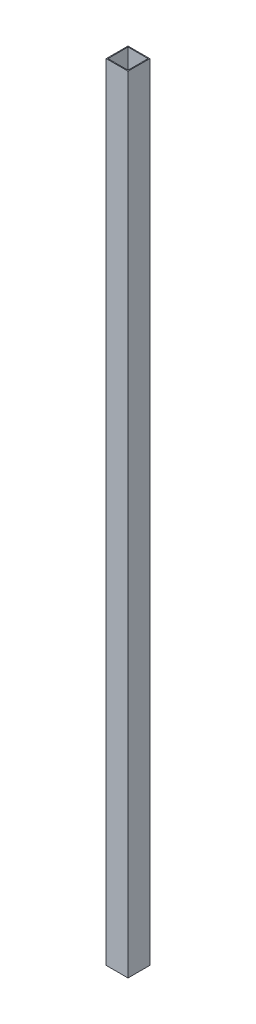
ISO-10303-21;
HEADER;
FILE_DESCRIPTION(('STEP AP214'),'2;1');
FILE_NAME('part.step','',(''),(''),'','','');
FILE_SCHEMA(('AUTOMOTIVE_DESIGN { 1 0 10303 214 1 1 1 1 }'));
ENDSEC;
DATA;
#1=APPLICATION_CONTEXT('core data for automotive mechanical design processes');
#2=APPLICATION_PROTOCOL_DEFINITION('international standard','automotive_design',2000,#1);
#3=PRODUCT_CONTEXT('',#1,'mechanical');
#4=PRODUCT('Part','Part','',(#3));
#5=PRODUCT_RELATED_PRODUCT_CATEGORY('part','',(#4));
#6=PRODUCT_DEFINITION_FORMATION('','',#4);
#7=PRODUCT_DEFINITION_CONTEXT('part definition',#1,'design');
#8=PRODUCT_DEFINITION('design','',#6,#7);
#9=PRODUCT_DEFINITION_SHAPE('','',#8);
#10=(LENGTH_UNIT() NAMED_UNIT(*) SI_UNIT(.MILLI.,.METRE.));
#11=(NAMED_UNIT(*) PLANE_ANGLE_UNIT() SI_UNIT($,.RADIAN.));
#12=(NAMED_UNIT(*) SI_UNIT($,.STERADIAN.) SOLID_ANGLE_UNIT());
#13=UNCERTAINTY_MEASURE_WITH_UNIT(LENGTH_MEASURE(1.E-05),#10,'distance_accuracy_value','');
#14=(GEOMETRIC_REPRESENTATION_CONTEXT(3) GLOBAL_UNCERTAINTY_ASSIGNED_CONTEXT((#13)) GLOBAL_UNIT_ASSIGNED_CONTEXT((#10,
#11,#12)) REPRESENTATION_CONTEXT('',''));
#15=CARTESIAN_POINT('',(0.,0.,0.));
#16=DIRECTION('',(0.,0.,1.));
#17=DIRECTION('',(1.,0.,0.));
#18=AXIS2_PLACEMENT_3D('',#15,#16,#17);
#19=CARTESIAN_POINT('',(0.,1800.,0.));
#20=DIRECTION('',(0.,-1.,0.));
#21=DIRECTION('',(0.,0.,-1.));
#22=AXIS2_PLACEMENT_3D('',#19,#20,#21);
#23=PLANE('',#22);
#24=DIRECTION('',(0.,0.,-1.));
#25=VECTOR('',#24,1.);
#26=CARTESIAN_POINT('',(25.,1800.,25.));
#27=LINE('',#26,#25);
#28=CARTESIAN_POINT('',(25.,1800.,25.));
#29=VERTEX_POINT('',#28);
#30=CARTESIAN_POINT('',(25.,1800.,-25.));
#31=VERTEX_POINT('',#30);
#32=EDGE_CURVE('E153',#29,#31,#27,.T.);
#33=ORIENTED_EDGE('',*,*,#32,.T.);
#34=DIRECTION('',(-1.,0.,0.));
#35=VECTOR('',#34,1.);
#36=CARTESIAN_POINT('',(-25.,1800.,-25.));
#37=LINE('',#36,#35);
#38=CARTESIAN_POINT('',(-25.,1800.,-25.));
#39=VERTEX_POINT('',#38);
#40=EDGE_CURVE('E157',#31,#39,#37,.T.);
#41=ORIENTED_EDGE('',*,*,#40,.T.);
#42=DIRECTION('',(0.,0.,1.));
#43=VECTOR('',#42,1.);
#44=CARTESIAN_POINT('',(-25.,1800.,25.));
#45=LINE('',#44,#43);
#46=CARTESIAN_POINT('',(-25.,1800.,25.));
#47=VERTEX_POINT('',#46);
#48=EDGE_CURVE('E161',#39,#47,#45,.T.);
#49=ORIENTED_EDGE('',*,*,#48,.T.);
#50=DIRECTION('',(1.,0.,0.));
#51=VECTOR('',#50,1.);
#52=CARTESIAN_POINT('',(-25.,1800.,25.));
#53=LINE('',#52,#51);
#54=EDGE_CURVE('E164',#47,#29,#53,.T.);
#55=ORIENTED_EDGE('',*,*,#54,.T.);
#56=EDGE_LOOP('',(#33,#41,#49,#55));
#57=FACE_BOUND('',#56,.T.);
#58=DIRECTION('',(0.,0.,1.));
#59=VECTOR('',#58,1.);
#60=CARTESIAN_POINT('',(-23.,1800.,23.));
#61=LINE('',#60,#59);
#62=CARTESIAN_POINT('',(-23.,1800.,-23.));
#63=VERTEX_POINT('',#62);
#64=CARTESIAN_POINT('',(-23.,1800.,23.));
#65=VERTEX_POINT('',#64);
#66=EDGE_CURVE('E105',#63,#65,#61,.T.);
#67=ORIENTED_EDGE('',*,*,#66,.F.);
#68=DIRECTION('',(-1.,0.,0.));
#69=VECTOR('',#68,1.);
#70=CARTESIAN_POINT('',(-23.,1800.,-23.));
#71=LINE('',#70,#69);
#72=CARTESIAN_POINT('',(23.,1800.,-23.));
#73=VERTEX_POINT('',#72);
#74=EDGE_CURVE('E131',#73,#63,#71,.T.);
#75=ORIENTED_EDGE('',*,*,#74,.F.);
#76=DIRECTION('',(0.,0.,-1.));
#77=VECTOR('',#76,1.);
#78=CARTESIAN_POINT('',(23.,1800.,23.));
#79=LINE('',#78,#77);
#80=CARTESIAN_POINT('',(23.,1800.,23.));
#81=VERTEX_POINT('',#80);
#82=EDGE_CURVE('E127',#81,#73,#79,.T.);
#83=ORIENTED_EDGE('',*,*,#82,.F.);
#84=DIRECTION('',(1.,0.,0.));
#85=VECTOR('',#84,1.);
#86=CARTESIAN_POINT('',(-23.,1800.,23.));
#87=LINE('',#86,#85);
#88=EDGE_CURVE('E114',#65,#81,#87,.T.);
#89=ORIENTED_EDGE('',*,*,#88,.F.);
#90=EDGE_LOOP('',(#67,#75,#83,#89));
#91=FACE_BOUND('',#90,.T.);
#92=ADVANCED_FACE('F39',(#57,#91),#23,.F.);
#93=CARTESIAN_POINT('',(0.,0.,0.));
#94=DIRECTION('',(0.,-1.,0.));
#95=DIRECTION('',(0.,0.,-1.));
#96=AXIS2_PLACEMENT_3D('',#93,#94,#95);
#97=PLANE('',#96);
#98=DIRECTION('',(0.,0.,-1.));
#99=VECTOR('',#98,1.);
#100=CARTESIAN_POINT('',(25.,0.,25.));
#101=LINE('',#100,#99);
#102=CARTESIAN_POINT('',(25.,0.,25.));
#103=VERTEX_POINT('',#102);
#104=CARTESIAN_POINT('',(25.,0.,-25.));
#105=VERTEX_POINT('',#104);
#106=EDGE_CURVE('E123',#103,#105,#101,.T.);
#107=ORIENTED_EDGE('',*,*,#106,.F.);
#108=DIRECTION('',(1.,0.,0.));
#109=VECTOR('',#108,1.);
#110=CARTESIAN_POINT('',(-25.,0.,25.));
#111=LINE('',#110,#109);
#112=CARTESIAN_POINT('',(-25.,0.,25.));
#113=VERTEX_POINT('',#112);
#114=EDGE_CURVE('E158',#113,#103,#111,.T.);
#115=ORIENTED_EDGE('',*,*,#114,.F.);
#116=DIRECTION('',(0.,0.,1.));
#117=VECTOR('',#116,1.);
#118=CARTESIAN_POINT('',(-25.,0.,25.));
#119=LINE('',#118,#117);
#120=CARTESIAN_POINT('',(-25.,0.,-25.));
#121=VERTEX_POINT('',#120);
#122=EDGE_CURVE('E174',#121,#113,#119,.T.);
#123=ORIENTED_EDGE('',*,*,#122,.F.);
#124=DIRECTION('',(-1.,0.,0.));
#125=VECTOR('',#124,1.);
#126=CARTESIAN_POINT('',(-25.,0.,-25.));
#127=LINE('',#126,#125);
#128=EDGE_CURVE('E171',#105,#121,#127,.T.);
#129=ORIENTED_EDGE('',*,*,#128,.F.);
#130=EDGE_LOOP('',(#107,#115,#123,#129));
#131=FACE_BOUND('',#130,.T.);
#132=DIRECTION('',(-1.,0.,0.));
#133=VECTOR('',#132,1.);
#134=CARTESIAN_POINT('',(-23.,0.,-23.));
#135=LINE('',#134,#133);
#136=CARTESIAN_POINT('',(23.,0.,-23.));
#137=VERTEX_POINT('',#136);
#138=CARTESIAN_POINT('',(-23.,0.,-23.));
#139=VERTEX_POINT('',#138);
#140=EDGE_CURVE('E115',#137,#139,#135,.T.);
#141=ORIENTED_EDGE('',*,*,#140,.T.);
#142=DIRECTION('',(0.,0.,1.));
#143=VECTOR('',#142,1.);
#144=CARTESIAN_POINT('',(-23.,0.,23.));
#145=LINE('',#144,#143);
#146=CARTESIAN_POINT('',(-23.,0.,23.));
#147=VERTEX_POINT('',#146);
#148=EDGE_CURVE('E63',#139,#147,#145,.T.);
#149=ORIENTED_EDGE('',*,*,#148,.T.);
#150=DIRECTION('',(1.,0.,0.));
#151=VECTOR('',#150,1.);
#152=CARTESIAN_POINT('',(-23.,0.,23.));
#153=LINE('',#152,#151);
#154=CARTESIAN_POINT('',(23.,0.,23.));
#155=VERTEX_POINT('',#154);
#156=EDGE_CURVE('E121',#147,#155,#153,.T.);
#157=ORIENTED_EDGE('',*,*,#156,.T.);
#158=DIRECTION('',(0.,0.,-1.));
#159=VECTOR('',#158,1.);
#160=CARTESIAN_POINT('',(23.,0.,23.));
#161=LINE('',#160,#159);
#162=EDGE_CURVE('E140',#155,#137,#161,.T.);
#163=ORIENTED_EDGE('',*,*,#162,.T.);
#164=EDGE_LOOP('',(#141,#149,#157,#163));
#165=FACE_BOUND('',#164,.T.);
#166=ADVANCED_FACE('F197',(#131,#165),#97,.T.);
#167=CARTESIAN_POINT('',(25.,1800.,25.));
#168=DIRECTION('',(-1.,0.,0.));
#169=DIRECTION('',(0.,0.,1.));
#170=AXIS2_PLACEMENT_3D('',#167,#168,#169);
#171=PLANE('',#170);
#172=ORIENTED_EDGE('',*,*,#106,.T.);
#173=DIRECTION('',(0.,-1.,0.));
#174=VECTOR('',#173,1.);
#175=CARTESIAN_POINT('',(25.,1800.,-25.));
#176=LINE('',#175,#174);
#177=EDGE_CURVE('E11',#31,#105,#176,.T.);
#178=ORIENTED_EDGE('',*,*,#177,.F.);
#179=ORIENTED_EDGE('',*,*,#32,.F.);
#180=DIRECTION('',(0.,-1.,0.));
#181=VECTOR('',#180,1.);
#182=CARTESIAN_POINT('',(25.,1800.,25.));
#183=LINE('',#182,#181);
#184=EDGE_CURVE('E167',#29,#103,#183,.T.);
#185=ORIENTED_EDGE('',*,*,#184,.T.);
#186=EDGE_LOOP('',(#172,#178,#179,#185));
#187=FACE_BOUND('',#186,.T.);
#188=ADVANCED_FACE('F41',(#187),#171,.F.);
#189=CARTESIAN_POINT('',(-25.,1800.,-25.));
#190=DIRECTION('',(0.,0.,1.));
#191=DIRECTION('',(1.,0.,0.));
#192=AXIS2_PLACEMENT_3D('',#189,#190,#191);
#193=PLANE('',#192);
#194=ORIENTED_EDGE('',*,*,#128,.T.);
#195=DIRECTION('',(0.,-1.,0.));
#196=VECTOR('',#195,1.);
#197=CARTESIAN_POINT('',(-25.,1800.,-25.));
#198=LINE('',#197,#196);
#199=EDGE_CURVE('E48',#39,#121,#198,.T.);
#200=ORIENTED_EDGE('',*,*,#199,.F.);
#201=ORIENTED_EDGE('',*,*,#40,.F.);
#202=ORIENTED_EDGE('',*,*,#177,.T.);
#203=EDGE_LOOP('',(#194,#200,#201,#202));
#204=FACE_BOUND('',#203,.T.);
#205=ADVANCED_FACE('F207',(#204),#193,.F.);
#206=CARTESIAN_POINT('',(-25.,1800.,25.));
#207=DIRECTION('',(1.,0.,0.));
#208=DIRECTION('',(0.,0.,-1.));
#209=AXIS2_PLACEMENT_3D('',#206,#207,#208);
#210=PLANE('',#209);
#211=ORIENTED_EDGE('',*,*,#122,.T.);
#212=DIRECTION('',(0.,-1.,0.));
#213=VECTOR('',#212,1.);
#214=CARTESIAN_POINT('',(-25.,1800.,25.));
#215=LINE('',#214,#213);
#216=EDGE_CURVE('E182',#47,#113,#215,.T.);
#217=ORIENTED_EDGE('',*,*,#216,.F.);
#218=ORIENTED_EDGE('',*,*,#48,.F.);
#219=ORIENTED_EDGE('',*,*,#199,.T.);
#220=EDGE_LOOP('',(#211,#217,#218,#219));
#221=FACE_BOUND('',#220,.T.);
#222=ADVANCED_FACE('F191',(#221),#210,.F.);
#223=CARTESIAN_POINT('',(-25.,1800.,25.));
#224=DIRECTION('',(0.,0.,-1.));
#225=DIRECTION('',(-1.,0.,0.));
#226=AXIS2_PLACEMENT_3D('',#223,#224,#225);
#227=PLANE('',#226);
#228=ORIENTED_EDGE('',*,*,#114,.T.);
#229=ORIENTED_EDGE('',*,*,#184,.F.);
#230=ORIENTED_EDGE('',*,*,#54,.F.);
#231=ORIENTED_EDGE('',*,*,#216,.T.);
#232=EDGE_LOOP('',(#228,#229,#230,#231));
#233=FACE_BOUND('',#232,.T.);
#234=ADVANCED_FACE('F201',(#233),#227,.F.);
#235=CARTESIAN_POINT('',(-23.,1800.,23.));
#236=DIRECTION('',(1.,0.,0.));
#237=DIRECTION('',(0.,0.,-1.));
#238=AXIS2_PLACEMENT_3D('',#235,#236,#237);
#239=PLANE('',#238);
#240=ORIENTED_EDGE('',*,*,#148,.F.);
#241=DIRECTION('',(0.,-1.,0.));
#242=VECTOR('',#241,1.);
#243=CARTESIAN_POINT('',(-23.,1800.,-23.));
#244=LINE('',#243,#242);
#245=EDGE_CURVE('E109',#63,#139,#244,.T.);
#246=ORIENTED_EDGE('',*,*,#245,.F.);
#247=ORIENTED_EDGE('',*,*,#66,.T.);
#248=DIRECTION('',(0.,-1.,0.));
#249=VECTOR('',#248,1.);
#250=CARTESIAN_POINT('',(-23.,1800.,23.));
#251=LINE('',#250,#249);
#252=EDGE_CURVE('E108',#65,#147,#251,.T.);
#253=ORIENTED_EDGE('',*,*,#252,.T.);
#254=EDGE_LOOP('',(#240,#246,#247,#253));
#255=FACE_BOUND('',#254,.T.);
#256=ADVANCED_FACE('F107',(#255),#239,.T.);
#257=CARTESIAN_POINT('',(-23.,1800.,23.));
#258=DIRECTION('',(0.,0.,-1.));
#259=DIRECTION('',(-1.,0.,0.));
#260=AXIS2_PLACEMENT_3D('',#257,#258,#259);
#261=PLANE('',#260);
#262=ORIENTED_EDGE('',*,*,#156,.F.);
#263=ORIENTED_EDGE('',*,*,#252,.F.);
#264=ORIENTED_EDGE('',*,*,#88,.T.);
#265=DIRECTION('',(0.,-1.,0.));
#266=VECTOR('',#265,1.);
#267=CARTESIAN_POINT('',(23.,1800.,23.));
#268=LINE('',#267,#266);
#269=EDGE_CURVE('E124',#81,#155,#268,.T.);
#270=ORIENTED_EDGE('',*,*,#269,.T.);
#271=EDGE_LOOP('',(#262,#263,#264,#270));
#272=FACE_BOUND('',#271,.T.);
#273=ADVANCED_FACE('F118',(#272),#261,.T.);
#274=CARTESIAN_POINT('',(23.,1800.,23.));
#275=DIRECTION('',(-1.,0.,0.));
#276=DIRECTION('',(0.,0.,1.));
#277=AXIS2_PLACEMENT_3D('',#274,#275,#276);
#278=PLANE('',#277);
#279=ORIENTED_EDGE('',*,*,#162,.F.);
#280=ORIENTED_EDGE('',*,*,#269,.F.);
#281=ORIENTED_EDGE('',*,*,#82,.T.);
#282=DIRECTION('',(0.,-1.,0.));
#283=VECTOR('',#282,1.);
#284=CARTESIAN_POINT('',(23.,1800.,-23.));
#285=LINE('',#284,#283);
#286=EDGE_CURVE('E55',#73,#137,#285,.T.);
#287=ORIENTED_EDGE('',*,*,#286,.T.);
#288=EDGE_LOOP('',(#279,#280,#281,#287));
#289=FACE_BOUND('',#288,.T.);
#290=ADVANCED_FACE('F230',(#289),#278,.T.);
#291=CARTESIAN_POINT('',(-23.,1800.,-23.));
#292=DIRECTION('',(0.,0.,1.));
#293=DIRECTION('',(1.,0.,0.));
#294=AXIS2_PLACEMENT_3D('',#291,#292,#293);
#295=PLANE('',#294);
#296=ORIENTED_EDGE('',*,*,#140,.F.);
#297=ORIENTED_EDGE('',*,*,#286,.F.);
#298=ORIENTED_EDGE('',*,*,#74,.T.);
#299=ORIENTED_EDGE('',*,*,#245,.T.);
#300=EDGE_LOOP('',(#296,#297,#298,#299));
#301=FACE_BOUND('',#300,.T.);
#302=ADVANCED_FACE('F234',(#301),#295,.T.);
#303=CLOSED_SHELL('',(#92,#166,#188,#205,#222,#234,#256,#273,#290,#302));
#304=MANIFOLD_SOLID_BREP('B2',#303);
#305=ADVANCED_BREP_SHAPE_REPRESENTATION('',(#18,#304),#14);
#306=SHAPE_DEFINITION_REPRESENTATION(#9,#305);
ENDSEC;
END-ISO-10303-21;
